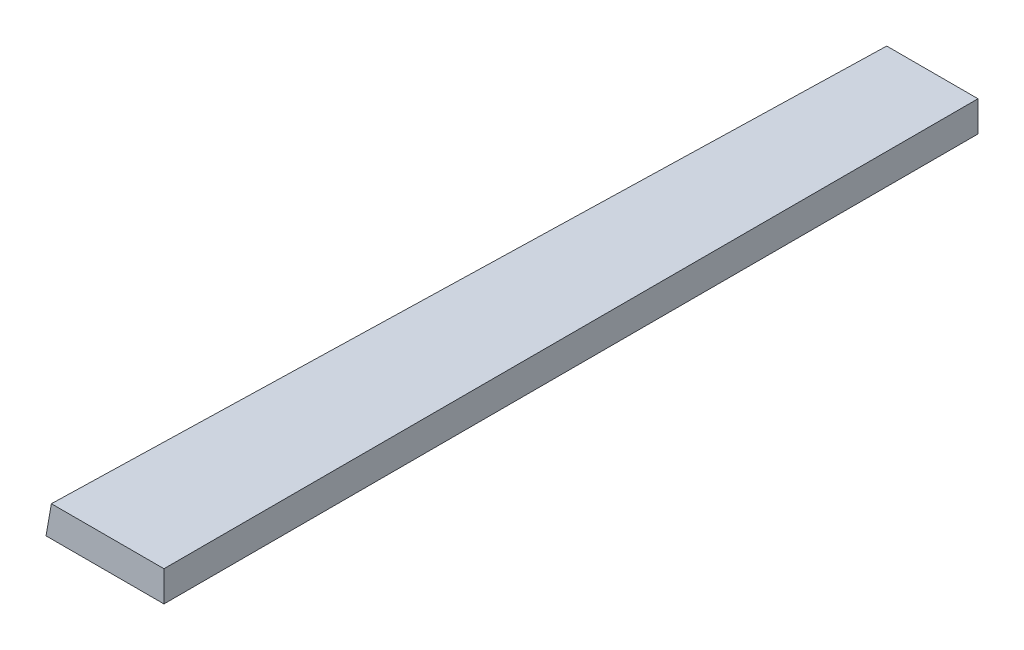
ISO-10303-21;
HEADER;
FILE_DESCRIPTION(('STEP AP214'),'2;1');
FILE_NAME('part.step','',(''),(''),'','','');
FILE_SCHEMA(('AUTOMOTIVE_DESIGN { 1 0 10303 214 1 1 1 1 }'));
ENDSEC;
DATA;
#1=APPLICATION_CONTEXT('core data for automotive mechanical design processes');
#2=APPLICATION_PROTOCOL_DEFINITION('international standard','automotive_design',2000,#1);
#3=PRODUCT_CONTEXT('',#1,'mechanical');
#4=PRODUCT('Part','Part','',(#3));
#5=PRODUCT_RELATED_PRODUCT_CATEGORY('part','',(#4));
#6=PRODUCT_DEFINITION_FORMATION('','',#4);
#7=PRODUCT_DEFINITION_CONTEXT('part definition',#1,'design');
#8=PRODUCT_DEFINITION('design','',#6,#7);
#9=PRODUCT_DEFINITION_SHAPE('','',#8);
#10=(LENGTH_UNIT() NAMED_UNIT(*) SI_UNIT(.MILLI.,.METRE.));
#11=(NAMED_UNIT(*) PLANE_ANGLE_UNIT() SI_UNIT($,.RADIAN.));
#12=(NAMED_UNIT(*) SI_UNIT($,.STERADIAN.) SOLID_ANGLE_UNIT());
#13=UNCERTAINTY_MEASURE_WITH_UNIT(LENGTH_MEASURE(1.E-05),#10,'distance_accuracy_value','');
#14=(GEOMETRIC_REPRESENTATION_CONTEXT(3) GLOBAL_UNCERTAINTY_ASSIGNED_CONTEXT((#13)) GLOBAL_UNIT_ASSIGNED_CONTEXT((#10,
#11,#12)) REPRESENTATION_CONTEXT('',''));
#15=CARTESIAN_POINT('',(0.,0.,0.));
#16=DIRECTION('',(0.,0.,1.));
#17=DIRECTION('',(1.,0.,0.));
#18=AXIS2_PLACEMENT_3D('',#15,#16,#17);
#19=CARTESIAN_POINT('',(38.1,19.05,-254.));
#20=DIRECTION('',(-1.,0.,0.));
#21=DIRECTION('',(0.,0.,1.));
#22=AXIS2_PLACEMENT_3D('',#19,#20,#21);
#23=PLANE('',#22);
#24=DIRECTION('',(0.,0.,-1.));
#25=VECTOR('',#24,1.);
#26=CARTESIAN_POINT('',(38.1,0.,-254.));
#27=LINE('',#26,#25);
#28=CARTESIAN_POINT('',(38.1,0.,254.));
#29=VERTEX_POINT('',#28);
#30=CARTESIAN_POINT('',(38.1,0.,-254.));
#31=VERTEX_POINT('',#30);
#32=EDGE_CURVE('E71',#29,#31,#27,.T.);
#33=ORIENTED_EDGE('',*,*,#32,.T.);
#34=DIRECTION('',(0.,-1.,0.));
#35=VECTOR('',#34,1.);
#36=CARTESIAN_POINT('',(38.1,19.05,-254.));
#37=LINE('',#36,#35);
#38=CARTESIAN_POINT('',(38.1,19.05,-254.));
#39=VERTEX_POINT('',#38);
#40=EDGE_CURVE('E73',#39,#31,#37,.T.);
#41=ORIENTED_EDGE('',*,*,#40,.F.);
#42=DIRECTION('',(0.,0.,-1.));
#43=VECTOR('',#42,1.);
#44=CARTESIAN_POINT('',(38.1,19.05,-254.));
#45=LINE('',#44,#43);
#46=CARTESIAN_POINT('',(38.1,19.05,254.));
#47=VERTEX_POINT('',#46);
#48=EDGE_CURVE('E58',#47,#39,#45,.T.);
#49=ORIENTED_EDGE('',*,*,#48,.F.);
#50=DIRECTION('',(0.,-1.,0.));
#51=VECTOR('',#50,1.);
#52=CARTESIAN_POINT('',(38.1,19.05,254.));
#53=LINE('',#52,#51);
#54=EDGE_CURVE('E43',#47,#29,#53,.T.);
#55=ORIENTED_EDGE('',*,*,#54,.T.);
#56=EDGE_LOOP('',(#33,#41,#49,#55));
#57=FACE_BOUND('',#56,.T.);
#58=ADVANCED_FACE('F34',(#57),#23,.F.);
#59=CARTESIAN_POINT('',(0.,19.05,0.));
#60=DIRECTION('',(0.,-1.,0.));
#61=DIRECTION('',(0.,0.,-1.));
#62=AXIS2_PLACEMENT_3D('',#59,#60,#61);
#63=PLANE('',#62);
#64=DIRECTION('',(-1.,0.,0.));
#65=VECTOR('',#64,1.);
#66=CARTESIAN_POINT('',(38.1,19.05,-254.));
#67=LINE('',#66,#65);
#68=CARTESIAN_POINT('',(-18.8573036914864,19.05,-254.));
#69=VERTEX_POINT('',#68);
#70=EDGE_CURVE('E86',#39,#69,#67,.T.);
#71=ORIENTED_EDGE('',*,*,#70,.T.);
#72=DIRECTION('',(-0.026176948307873,0.,0.999657324975557));
#73=VECTOR('',#72,1.);
#74=CARTESIAN_POINT('',(-25.4910484946744,19.05,-0.66750659659788));
#75=LINE('',#74,#73);
#76=CARTESIAN_POINT('',(-32.1597518486333,19.05,254.));
#77=VERTEX_POINT('',#76);
#78=EDGE_CURVE('E100',#69,#77,#75,.T.);
#79=ORIENTED_EDGE('',*,*,#78,.T.);
#80=DIRECTION('',(1.,0.,0.));
#81=VECTOR('',#80,1.);
#82=CARTESIAN_POINT('',(38.1,19.05,254.));
#83=LINE('',#82,#81);
#84=EDGE_CURVE('E90',#77,#47,#83,.T.);
#85=ORIENTED_EDGE('',*,*,#84,.T.);
#86=ORIENTED_EDGE('',*,*,#48,.T.);
#87=EDGE_LOOP('',(#71,#79,#85,#86));
#88=FACE_BOUND('',#87,.T.);
#89=ADVANCED_FACE('F114',(#88),#63,.F.);
#90=CARTESIAN_POINT('',(0.,0.,0.));
#91=DIRECTION('',(0.,-1.,0.));
#92=DIRECTION('',(0.,0.,-1.));
#93=AXIS2_PLACEMENT_3D('',#90,#91,#92);
#94=PLANE('',#93);
#95=DIRECTION('',(-0.026176948307873,0.,0.999657324975557));
#96=VECTOR('',#95,1.);
#97=CARTESIAN_POINT('',(-28.8489264218319,0.,-0.755435724637329));
#98=LINE('',#97,#96);
#99=CARTESIAN_POINT('',(-22.2174841238944,0.,-254.));
#100=VERTEX_POINT('',#99);
#101=CARTESIAN_POINT('',(-35.5199322810412,0.,254.));
#102=VERTEX_POINT('',#101);
#103=EDGE_CURVE('E11',#100,#102,#98,.T.);
#104=ORIENTED_EDGE('',*,*,#103,.F.);
#105=DIRECTION('',(-1.,0.,0.));
#106=VECTOR('',#105,1.);
#107=CARTESIAN_POINT('',(38.1,0.,-254.));
#108=LINE('',#107,#106);
#109=EDGE_CURVE('E80',#31,#100,#108,.T.);
#110=ORIENTED_EDGE('',*,*,#109,.F.);
#111=ORIENTED_EDGE('',*,*,#32,.F.);
#112=DIRECTION('',(1.,0.,0.));
#113=VECTOR('',#112,1.);
#114=CARTESIAN_POINT('',(38.1,0.,254.));
#115=LINE('',#114,#113);
#116=EDGE_CURVE('E81',#102,#29,#115,.T.);
#117=ORIENTED_EDGE('',*,*,#116,.F.);
#118=EDGE_LOOP('',(#104,#110,#111,#117));
#119=FACE_BOUND('',#118,.T.);
#120=ADVANCED_FACE('F88',(#119),#94,.T.);
#121=CARTESIAN_POINT('',(38.1,19.05,-254.));
#122=DIRECTION('',(0.,0.,1.));
#123=DIRECTION('',(1.,0.,0.));
#124=AXIS2_PLACEMENT_3D('',#121,#122,#123);
#125=PLANE('',#124);
#126=ORIENTED_EDGE('',*,*,#109,.T.);
#127=DIRECTION('',(0.173705907155943,0.984797572001034,0.));
#128=VECTOR('',#127,1.);
#129=CARTESIAN_POINT('',(-17.1386886945821,28.7934100190765,-254.));
#130=LINE('',#129,#128);
#131=EDGE_CURVE('E49',#100,#69,#130,.T.);
#132=ORIENTED_EDGE('',*,*,#131,.T.);
#133=ORIENTED_EDGE('',*,*,#70,.F.);
#134=ORIENTED_EDGE('',*,*,#40,.T.);
#135=EDGE_LOOP('',(#126,#132,#133,#134));
#136=FACE_BOUND('',#135,.T.);
#137=ADVANCED_FACE('F85',(#136),#125,.F.);
#138=CARTESIAN_POINT('',(38.1,19.05,254.));
#139=DIRECTION('',(0.,0.,-1.));
#140=DIRECTION('',(-1.,0.,0.));
#141=AXIS2_PLACEMENT_3D('',#138,#139,#140);
#142=PLANE('',#141);
#143=ORIENTED_EDGE('',*,*,#84,.F.);
#144=DIRECTION('',(-0.173705907155943,-0.984797572001034,0.));
#145=VECTOR('',#144,1.);
#146=CARTESIAN_POINT('',(-30.0397522106608,31.068995383065,254.));
#147=LINE('',#146,#145);
#148=EDGE_CURVE('E106',#77,#102,#147,.T.);
#149=ORIENTED_EDGE('',*,*,#148,.T.);
#150=ORIENTED_EDGE('',*,*,#116,.T.);
#151=ORIENTED_EDGE('',*,*,#54,.F.);
#152=EDGE_LOOP('',(#143,#149,#150,#151));
#153=FACE_BOUND('',#152,.T.);
#154=ADVANCED_FACE('F36',(#153),#142,.F.);
#155=CARTESIAN_POINT('',(-16.2754658449368,33.4041392027517,-255.907444990344));
#156=DIRECTION('',(0.984470283991374,-0.173648177666924,0.0257792616437931));
#157=DIRECTION('',(0.173705907155943,0.984797572001034,0.));
#158=AXIS2_PLACEMENT_3D('',#155,#156,#157);
#159=PLANE('',#158);
#160=ORIENTED_EDGE('',*,*,#131,.F.);
#161=ORIENTED_EDGE('',*,*,#103,.T.);
#162=ORIENTED_EDGE('',*,*,#148,.F.);
#163=ORIENTED_EDGE('',*,*,#78,.F.);
#164=EDGE_LOOP('',(#160,#161,#162,#163));
#165=FACE_BOUND('',#164,.T.);
#166=ADVANCED_FACE('F119',(#165),#159,.F.);
#167=CLOSED_SHELL('',(#58,#89,#120,#137,#154,#166));
#168=MANIFOLD_SOLID_BREP('B2',#167);
#169=ADVANCED_BREP_SHAPE_REPRESENTATION('',(#18,#168),#14);
#170=SHAPE_DEFINITION_REPRESENTATION(#9,#169);
ENDSEC;
END-ISO-10303-21;
